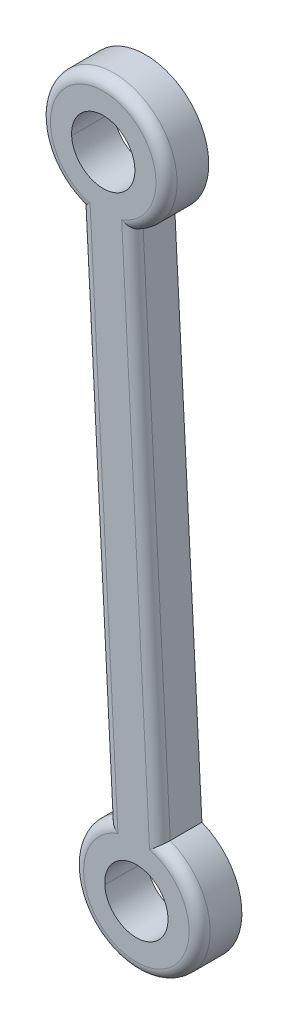
ISO-10303-21;
HEADER;
FILE_DESCRIPTION(('STEP AP214'),'2;1');
FILE_NAME('part.step','',(''),(''),'','','');
FILE_SCHEMA(('AUTOMOTIVE_DESIGN { 1 0 10303 214 1 1 1 1 }'));
ENDSEC;
DATA;
#1=APPLICATION_CONTEXT('core data for automotive mechanical design processes');
#2=APPLICATION_PROTOCOL_DEFINITION('international standard','automotive_design',2000,#1);
#3=PRODUCT_CONTEXT('',#1,'mechanical');
#4=PRODUCT('Part','Part','',(#3));
#5=PRODUCT_RELATED_PRODUCT_CATEGORY('part','',(#4));
#6=PRODUCT_DEFINITION_FORMATION('','',#4);
#7=PRODUCT_DEFINITION_CONTEXT('part definition',#1,'design');
#8=PRODUCT_DEFINITION('design','',#6,#7);
#9=PRODUCT_DEFINITION_SHAPE('','',#8);
#10=(LENGTH_UNIT() NAMED_UNIT(*) SI_UNIT(.MILLI.,.METRE.));
#11=(NAMED_UNIT(*) PLANE_ANGLE_UNIT() SI_UNIT($,.RADIAN.));
#12=(NAMED_UNIT(*) SI_UNIT($,.STERADIAN.) SOLID_ANGLE_UNIT());
#13=UNCERTAINTY_MEASURE_WITH_UNIT(LENGTH_MEASURE(1.E-05),#10,'distance_accuracy_value','');
#14=(GEOMETRIC_REPRESENTATION_CONTEXT(3) GLOBAL_UNCERTAINTY_ASSIGNED_CONTEXT((#13)) GLOBAL_UNIT_ASSIGNED_CONTEXT((#10,
#11,#12)) REPRESENTATION_CONTEXT('',''));
#15=CARTESIAN_POINT('',(0.,0.,0.));
#16=DIRECTION('',(0.,0.,1.));
#17=DIRECTION('',(1.,0.,0.));
#18=AXIS2_PLACEMENT_3D('',#15,#16,#17);
#19=CARTESIAN_POINT('',(302.865836136789,-205.133323148578,53.45));
#20=DIRECTION('',(0.,0.,1.));
#21=DIRECTION('',(-0.998629534754574,-0.052335956242944,0.));
#22=AXIS2_PLACEMENT_3D('',#19,#20,#21);
#23=PLANE('',#22);
#24=CARTESIAN_POINT('',(301.295757449501,-175.174437105941,53.4500000000001));
#25=DIRECTION('',(0.,0.,-1.));
#26=DIRECTION('',(0.998629534754574,0.052335956242944,0.));
#27=AXIS2_PLACEMENT_3D('',#24,#25,#26);
#28=CIRCLE('',#27,1.5);
#29=CARTESIAN_POINT('',(302.793701751633,-175.095933171576,53.4500000000001));
#30=VERTEX_POINT('',#29);
#31=CARTESIAN_POINT('',(299.797813147369,-175.252941040305,53.4500000000001));
#32=VERTEX_POINT('',#31);
#33=EDGE_CURVE('E315',#30,#32,#28,.T.);
#34=ORIENTED_EDGE('',*,*,#33,.F.);
#35=CARTESIAN_POINT('',(301.295757449501,-175.174437105941,53.4500000000001));
#36=DIRECTION('',(0.,0.,-1.));
#37=DIRECTION('',(-0.998629534754574,-0.052335956242944,0.));
#38=AXIS2_PLACEMENT_3D('',#35,#36,#37);
#39=CIRCLE('',#38,1.5);
#40=EDGE_CURVE('E66',#32,#30,#39,.T.);
#41=ORIENTED_EDGE('',*,*,#40,.F.);
#42=EDGE_LOOP('',(#34,#41));
#43=FACE_BOUND('',#42,.T.);
#44=CARTESIAN_POINT('',(302.865836136789,-205.133323148578,53.45));
#45=DIRECTION('',(0.,0.,1.));
#46=DIRECTION('',(0.998629534754574,0.052335956242944,0.));
#47=AXIS2_PLACEMENT_3D('',#44,#45,#46);
#48=CIRCLE('',#47,1.5);
#49=CARTESIAN_POINT('',(304.363780438921,-205.054819214214,53.45));
#50=VERTEX_POINT('',#49);
#51=CARTESIAN_POINT('',(301.367891834657,-205.211827082942,53.45));
#52=VERTEX_POINT('',#51);
#53=EDGE_CURVE('E11',#50,#52,#48,.T.);
#54=ORIENTED_EDGE('',*,*,#53,.T.);
#55=CARTESIAN_POINT('',(302.865836136789,-205.133323148578,53.45));
#56=DIRECTION('',(0.,0.,1.));
#57=DIRECTION('',(-0.998629534754574,-0.052335956242944,0.));
#58=AXIS2_PLACEMENT_3D('',#55,#56,#57);
#59=CIRCLE('',#58,1.5);
#60=EDGE_CURVE('E57',#52,#50,#59,.T.);
#61=ORIENTED_EDGE('',*,*,#60,.T.);
#62=EDGE_LOOP('',(#54,#61));
#63=FACE_BOUND('',#62,.T.);
#64=DIRECTION('',(0.052335956242944,-0.998629534754574,0.));
#65=VECTOR('',#64,1.);
#66=CARTESIAN_POINT('',(300.190200001032,-177.963297577197,53.4500000000001));
#67=LINE('',#66,#65);
#68=CARTESIAN_POINT('',(300.190200001032,-177.963297577197,53.4500000000001));
#69=VERTEX_POINT('',#68);
#70=CARTESIAN_POINT('',(301.474819748371,-202.475302567929,53.45));
#71=VERTEX_POINT('',#70);
#72=EDGE_CURVE('E268',#69,#71,#67,.T.);
#73=ORIENTED_EDGE('',*,*,#72,.F.);
#74=CARTESIAN_POINT('',(301.295757449501,-175.174437105941,53.4500000000001));
#75=DIRECTION('',(0.,0.,1.));
#76=DIRECTION('',(0.46367212947261,-0.886006860216295,0.));
#77=AXIS2_PLACEMENT_3D('',#74,#75,#76);
#78=CIRCLE('',#77,3.);
#79=CARTESIAN_POINT('',(302.686773837919,-177.83245768659,53.4500000000001));
#80=VERTEX_POINT('',#79);
#81=EDGE_CURVE('E159',#80,#69,#78,.T.);
#82=ORIENTED_EDGE('',*,*,#81,.F.);
#83=DIRECTION('',(-0.052335956242944,0.998629534754574,0.));
#84=VECTOR('',#83,1.);
#85=CARTESIAN_POINT('',(303.971393585258,-202.344462677322,53.45));
#86=LINE('',#85,#84);
#87=CARTESIAN_POINT('',(303.971393585258,-202.344462677322,53.45));
#88=VERTEX_POINT('',#87);
#89=EDGE_CURVE('E193',#88,#80,#86,.T.);
#90=ORIENTED_EDGE('',*,*,#89,.F.);
#91=CARTESIAN_POINT('',(302.865836136789,-205.133323148578,53.45));
#92=DIRECTION('',(0.,0.,1.));
#93=DIRECTION('',(-0.46367212947261,0.886006860216295,0.));
#94=AXIS2_PLACEMENT_3D('',#91,#92,#93);
#95=CIRCLE('',#94,3.);
#96=EDGE_CURVE('E252',#71,#88,#95,.T.);
#97=ORIENTED_EDGE('',*,*,#96,.F.);
#98=EDGE_LOOP('',(#73,#82,#90,#97));
#99=FACE_BOUND('',#98,.T.);
#100=ADVANCED_FACE('F46',(#43,#63,#99),#23,.F.);
#101=CARTESIAN_POINT('',(301.295757449501,-175.174437105941,55.4500000000001));
#102=DIRECTION('',(0.,0.,1.));
#103=DIRECTION('',(-0.998629534754574,-0.052335956242944,0.));
#104=AXIS2_PLACEMENT_3D('',#101,#102,#103);
#105=CYLINDRICAL_SURFACE('',#104,1.5);
#106=CARTESIAN_POINT('',(301.295757449501,-175.174437105941,55.4500000000001));
#107=DIRECTION('',(0.,0.,-1.));
#108=DIRECTION('',(0.998629534754574,0.052335956242944,0.));
#109=AXIS2_PLACEMENT_3D('',#106,#107,#108);
#110=CIRCLE('',#109,1.5);
#111=CARTESIAN_POINT('',(302.793701751633,-175.095933171576,55.4500000000001));
#112=VERTEX_POINT('',#111);
#113=CARTESIAN_POINT('',(299.797813147369,-175.252941040305,55.4500000000001));
#114=VERTEX_POINT('',#113);
#115=EDGE_CURVE('E144',#112,#114,#110,.T.);
#116=ORIENTED_EDGE('',*,*,#115,.F.);
#117=DIRECTION('',(0.,0.,-1.));
#118=VECTOR('',#117,1.);
#119=CARTESIAN_POINT('',(302.793701751633,-175.095933171576,55.4500000000001));
#120=LINE('',#119,#118);
#121=EDGE_CURVE('E309',#112,#30,#120,.T.);
#122=ORIENTED_EDGE('',*,*,#121,.T.);
#123=ORIENTED_EDGE('',*,*,#33,.T.);
#124=DIRECTION('',(0.,0.,-1.));
#125=VECTOR('',#124,1.);
#126=CARTESIAN_POINT('',(299.797813147369,-175.252941040305,55.4500000000001));
#127=LINE('',#126,#125);
#128=EDGE_CURVE('E310',#114,#32,#127,.T.);
#129=ORIENTED_EDGE('',*,*,#128,.F.);
#130=EDGE_LOOP('',(#116,#122,#123,#129));
#131=FACE_BOUND('',#130,.T.);
#132=ADVANCED_FACE('F307',(#131),#105,.F.);
#133=CARTESIAN_POINT('',(301.295757449501,-175.174437105941,55.4500000000001));
#134=DIRECTION('',(0.,0.,1.));
#135=DIRECTION('',(-0.998629534754574,-0.052335956242944,0.));
#136=AXIS2_PLACEMENT_3D('',#133,#134,#135);
#137=CYLINDRICAL_SURFACE('',#136,1.5);
#138=ORIENTED_EDGE('',*,*,#40,.T.);
#139=ORIENTED_EDGE('',*,*,#121,.F.);
#140=CARTESIAN_POINT('',(301.295757449501,-175.174437105941,55.4500000000001));
#141=DIRECTION('',(0.,0.,-1.));
#142=DIRECTION('',(-0.998629534754574,-0.052335956242944,0.));
#143=AXIS2_PLACEMENT_3D('',#140,#141,#142);
#144=CIRCLE('',#143,1.5);
#145=EDGE_CURVE('E155',#114,#112,#144,.T.);
#146=ORIENTED_EDGE('',*,*,#145,.F.);
#147=ORIENTED_EDGE('',*,*,#128,.T.);
#148=EDGE_LOOP('',(#138,#139,#146,#147));
#149=FACE_BOUND('',#148,.T.);
#150=ADVANCED_FACE('F314',(#149),#137,.F.);
#151=CARTESIAN_POINT('',(302.865836136789,-205.133323148578,55.45));
#152=DIRECTION('',(0.,0.,-1.));
#153=DIRECTION('',(-0.998629534754574,-0.052335956242944,0.));
#154=AXIS2_PLACEMENT_3D('',#151,#152,#153);
#155=CYLINDRICAL_SURFACE('',#154,1.5);
#156=DIRECTION('',(0.,0.,-1.));
#157=VECTOR('',#156,1.);
#158=CARTESIAN_POINT('',(304.363780438921,-205.054819214214,55.45));
#159=LINE('',#158,#157);
#160=CARTESIAN_POINT('',(304.363780438921,-205.054819214214,55.45));
#161=VERTEX_POINT('',#160);
#162=EDGE_CURVE('E327',#161,#50,#159,.T.);
#163=ORIENTED_EDGE('',*,*,#162,.F.);
#164=CARTESIAN_POINT('',(302.865836136789,-205.133323148578,55.45));
#165=DIRECTION('',(0.,0.,1.));
#166=DIRECTION('',(0.998629534754574,0.052335956242944,0.));
#167=AXIS2_PLACEMENT_3D('',#164,#165,#166);
#168=CIRCLE('',#167,1.5);
#169=CARTESIAN_POINT('',(301.367891834657,-205.211827082942,55.45));
#170=VERTEX_POINT('',#169);
#171=EDGE_CURVE('E325',#161,#170,#168,.T.);
#172=ORIENTED_EDGE('',*,*,#171,.T.);
#173=DIRECTION('',(0.,0.,-1.));
#174=VECTOR('',#173,1.);
#175=CARTESIAN_POINT('',(301.367891834657,-205.211827082942,55.45));
#176=LINE('',#175,#174);
#177=EDGE_CURVE('E322',#170,#52,#176,.T.);
#178=ORIENTED_EDGE('',*,*,#177,.T.);
#179=ORIENTED_EDGE('',*,*,#53,.F.);
#180=EDGE_LOOP('',(#163,#172,#178,#179));
#181=FACE_BOUND('',#180,.T.);
#182=ADVANCED_FACE('F230',(#181),#155,.F.);
#183=CARTESIAN_POINT('',(302.865836136789,-205.133323148578,55.45));
#184=DIRECTION('',(0.,0.,-1.));
#185=DIRECTION('',(-0.998629534754574,-0.052335956242944,0.));
#186=AXIS2_PLACEMENT_3D('',#183,#184,#185);
#187=CYLINDRICAL_SURFACE('',#186,1.5);
#188=ORIENTED_EDGE('',*,*,#177,.F.);
#189=CARTESIAN_POINT('',(302.865836136789,-205.133323148578,55.45));
#190=DIRECTION('',(0.,0.,1.));
#191=DIRECTION('',(-0.998629534754574,-0.052335956242944,0.));
#192=AXIS2_PLACEMENT_3D('',#189,#190,#191);
#193=CIRCLE('',#192,1.5);
#194=EDGE_CURVE('E326',#170,#161,#193,.T.);
#195=ORIENTED_EDGE('',*,*,#194,.T.);
#196=ORIENTED_EDGE('',*,*,#162,.T.);
#197=ORIENTED_EDGE('',*,*,#60,.F.);
#198=EDGE_LOOP('',(#188,#195,#196,#197));
#199=FACE_BOUND('',#198,.T.);
#200=ADVANCED_FACE('F335',(#199),#187,.F.);
#201=CARTESIAN_POINT('',(300.190200001032,-177.963297577197,53.4500000000001));
#202=DIRECTION('',(-0.998629534754574,-0.052335956242944,0.));
#203=DIRECTION('',(0.052335956242944,-0.998629534754574,0.));
#204=AXIS2_PLACEMENT_3D('',#201,#202,#203);
#205=PLANE('',#204);
#206=DIRECTION('',(0.,0.,1.));
#207=VECTOR('',#206,1.);
#208=CARTESIAN_POINT('',(300.190200001032,-177.963297577197,53.4500000000001));
#209=LINE('',#208,#207);
#210=CARTESIAN_POINT('',(300.190200001008,-177.963297576747,54.9500000000001));
#211=VERTEX_POINT('',#210);
#212=EDGE_CURVE('E192',#69,#211,#209,.T.);
#213=ORIENTED_EDGE('',*,*,#212,.F.);
#214=ORIENTED_EDGE('',*,*,#72,.T.);
#215=DIRECTION('',(0.,0.,1.));
#216=VECTOR('',#215,1.);
#217=CARTESIAN_POINT('',(301.474819748371,-202.475302567929,53.45));
#218=LINE('',#217,#216);
#219=CARTESIAN_POINT('',(301.474819748528,-202.475302568228,54.95));
#220=VERTEX_POINT('',#219);
#221=EDGE_CURVE('E264',#71,#220,#218,.T.);
#222=ORIENTED_EDGE('',*,*,#221,.T.);
#223=DIRECTION('',(-0.052335956242944,0.998629534754574,0.));
#224=VECTOR('',#223,1.);
#225=CARTESIAN_POINT('',(301.474819748371,-202.475302567929,54.95));
#226=LINE('',#225,#224);
#227=EDGE_CURVE('E153',#220,#211,#226,.T.);
#228=ORIENTED_EDGE('',*,*,#227,.T.);
#229=EDGE_LOOP('',(#213,#214,#222,#228));
#230=FACE_BOUND('',#229,.T.);
#231=ADVANCED_FACE('F298',(#230),#205,.T.);
#232=CARTESIAN_POINT('',(301.295757449501,-175.174437105941,53.4500000000001));
#233=DIRECTION('',(0.,0.,-1.));
#234=DIRECTION('',(-0.998629534754574,-0.052335956242944,0.));
#235=AXIS2_PLACEMENT_3D('',#232,#233,#234);
#236=CYLINDRICAL_SURFACE('',#235,3.);
#237=ORIENTED_EDGE('',*,*,#81,.T.);
#238=ORIENTED_EDGE('',*,*,#212,.T.);
#239=CARTESIAN_POINT('',(301.295757449501,-175.174437105941,54.9500000000001));
#240=DIRECTION('',(0.,0.,-1.));
#241=DIRECTION('',(-0.368519149605924,-0.929620157039276,0.));
#242=AXIS2_PLACEMENT_3D('',#239,#240,#241);
#243=CIRCLE('',#242,2.99999999918055);
#244=CARTESIAN_POINT('',(302.68677383784,-177.832457686399,54.9500000000001));
#245=VERTEX_POINT('',#244);
#246=EDGE_CURVE('E112',#211,#245,#243,.T.);
#247=ORIENTED_EDGE('',*,*,#246,.T.);
#248=DIRECTION('',(0.,0.,1.));
#249=VECTOR('',#248,1.);
#250=CARTESIAN_POINT('',(302.686773837919,-177.83245768659,53.4500000000001));
#251=LINE('',#250,#249);
#252=EDGE_CURVE('E284',#80,#245,#251,.T.);
#253=ORIENTED_EDGE('',*,*,#252,.F.);
#254=EDGE_LOOP('',(#237,#238,#247,#253));
#255=FACE_BOUND('',#254,.T.);
#256=ADVANCED_FACE('F293',(#255),#236,.T.);
#257=CARTESIAN_POINT('',(303.971393585258,-202.344462677322,53.45));
#258=DIRECTION('',(0.998629534754574,0.052335956242944,0.));
#259=DIRECTION('',(-0.052335956242944,0.998629534754574,0.));
#260=AXIS2_PLACEMENT_3D('',#257,#258,#259);
#261=PLANE('',#260);
#262=DIRECTION('',(0.,0.,1.));
#263=VECTOR('',#262,1.);
#264=CARTESIAN_POINT('',(303.971393585258,-202.344462677322,53.45));
#265=LINE('',#264,#263);
#266=CARTESIAN_POINT('',(303.971393585133,-202.344462677635,54.95));
#267=VERTEX_POINT('',#266);
#268=EDGE_CURVE('E246',#88,#267,#265,.T.);
#269=ORIENTED_EDGE('',*,*,#268,.F.);
#270=ORIENTED_EDGE('',*,*,#89,.T.);
#271=ORIENTED_EDGE('',*,*,#252,.T.);
#272=DIRECTION('',(0.052335956242944,-0.998629534754574,0.));
#273=VECTOR('',#272,1.);
#274=CARTESIAN_POINT('',(302.686773837919,-177.83245768659,54.9500000000001));
#275=LINE('',#274,#273);
#276=EDGE_CURVE('E255',#245,#267,#275,.T.);
#277=ORIENTED_EDGE('',*,*,#276,.T.);
#278=EDGE_LOOP('',(#269,#270,#271,#277));
#279=FACE_BOUND('',#278,.T.);
#280=ADVANCED_FACE('F287',(#279),#261,.T.);
#281=CARTESIAN_POINT('',(302.865836136789,-205.133323148578,53.45));
#282=DIRECTION('',(0.,0.,-1.));
#283=DIRECTION('',(-0.998629534754574,-0.052335956242944,0.));
#284=AXIS2_PLACEMENT_3D('',#281,#282,#283);
#285=CYLINDRICAL_SURFACE('',#284,3.);
#286=ORIENTED_EDGE('',*,*,#221,.F.);
#287=ORIENTED_EDGE('',*,*,#96,.T.);
#288=ORIENTED_EDGE('',*,*,#268,.T.);
#289=CARTESIAN_POINT('',(302.865836136789,-205.133323148578,54.95));
#290=DIRECTION('',(0.,0.,-1.));
#291=DIRECTION('',(0.368519149489536,0.929620157085414,0.));
#292=AXIS2_PLACEMENT_3D('',#289,#290,#291);
#293=CIRCLE('',#292,2.99999999932575);
#294=EDGE_CURVE('E103',#267,#220,#293,.T.);
#295=ORIENTED_EDGE('',*,*,#294,.T.);
#296=EDGE_LOOP('',(#286,#287,#288,#295));
#297=FACE_BOUND('',#296,.T.);
#298=ADVANCED_FACE('F175',(#297),#285,.T.);
#299=CARTESIAN_POINT('',(302.865836136789,-205.133323148578,55.45));
#300=DIRECTION('',(0.,0.,1.));
#301=DIRECTION('',(-0.998629534754574,-0.052335956242944,0.));
#302=AXIS2_PLACEMENT_3D('',#299,#300,#301);
#303=PLANE('',#302);
#304=DIRECTION('',(-0.052335956242944,0.998629534754574,0.));
#305=VECTOR('',#304,1.);
#306=CARTESIAN_POINT('',(303.489994987132,-202.712491529864,55.45));
#307=LINE('',#306,#305);
#308=CARTESIAN_POINT('',(303.489994987132,-202.712491529864,55.45));
#309=VERTEX_POINT('',#308);
#310=CARTESIAN_POINT('',(302.169542901281,-177.516764790139,55.4500000000001));
#311=VERTEX_POINT('',#310);
#312=EDGE_CURVE('E200',#309,#311,#307,.T.);
#313=ORIENTED_EDGE('',*,*,#312,.T.);
#314=CARTESIAN_POINT('',(301.295757449501,-175.174437105941,55.4500000000001));
#315=DIRECTION('',(0.,0.,1.));
#316=DIRECTION('',(0.349514180826739,-0.936931073986242,0.));
#317=AXIS2_PLACEMENT_3D('',#314,#315,#316);
#318=CIRCLE('',#317,2.49999999918055);
#319=CARTESIAN_POINT('',(300.671598599149,-177.595268724503,55.4500000000001));
#320=VERTEX_POINT('',#319);
#321=EDGE_CURVE('E148',#311,#320,#318,.T.);
#322=ORIENTED_EDGE('',*,*,#321,.T.);
#323=DIRECTION('',(0.052335956242944,-0.998629534754574,0.));
#324=VECTOR('',#323,1.);
#325=CARTESIAN_POINT('',(300.671598599149,-177.595268724503,55.4500000000001));
#326=LINE('',#325,#324);
#327=CARTESIAN_POINT('',(301.99205068501,-202.790995464206,55.45));
#328=VERTEX_POINT('',#327);
#329=EDGE_CURVE('E128',#320,#328,#326,.T.);
#330=ORIENTED_EDGE('',*,*,#329,.T.);
#331=CARTESIAN_POINT('',(302.865836136789,-205.133323148578,55.45));
#332=DIRECTION('',(0.,0.,1.));
#333=DIRECTION('',(-0.349514180803439,0.936931073994935,0.));
#334=AXIS2_PLACEMENT_3D('',#331,#332,#333);
#335=CIRCLE('',#334,2.49999999932575);
#336=EDGE_CURVE('E135',#328,#309,#335,.T.);
#337=ORIENTED_EDGE('',*,*,#336,.T.);
#338=EDGE_LOOP('',(#313,#322,#330,#337));
#339=FACE_BOUND('',#338,.T.);
#340=ORIENTED_EDGE('',*,*,#115,.T.);
#341=ORIENTED_EDGE('',*,*,#145,.T.);
#342=EDGE_LOOP('',(#340,#341));
#343=FACE_BOUND('',#342,.T.);
#344=ORIENTED_EDGE('',*,*,#171,.F.);
#345=ORIENTED_EDGE('',*,*,#194,.F.);
#346=EDGE_LOOP('',(#344,#345));
#347=FACE_BOUND('',#346,.T.);
#348=ADVANCED_FACE('F146',(#339,#343,#347),#303,.T.);
#349=CARTESIAN_POINT('',(304.729977346551,-255.033748334242,54.9499999999998));
#350=DIRECTION('',(0.052335956242944,-0.998629534754574,0.));
#351=DIRECTION('',(-0.998629534754574,-0.052335956242944,0.));
#352=AXIS2_PLACEMENT_3D('',#349,#350,#351);
#353=CYLINDRICAL_SURFACE('',#352,0.5);
#354=CARTESIAN_POINT('',(300.190200000985,-177.963297576297,54.9500000000001));
#355=CARTESIAN_POINT('',(300.190222896927,-177.96330668927,54.9544047902578));
#356=CARTESIAN_POINT('',(300.190300763952,-177.963274908456,54.9588093734923));
#357=CARTESIAN_POINT('',(300.190566216192,-177.963129740869,54.967614633719));
#358=CARTESIAN_POINT('',(300.190753819973,-177.963016340286,54.972015309924));
#359=CARTESIAN_POINT('',(300.191238619374,-177.962708044702,54.9808096846352));
#360=CARTESIAN_POINT('',(300.191535862685,-177.962513114235,54.9852033792681));
#361=CARTESIAN_POINT('',(300.192239694194,-177.962041947289,54.993980734078));
#362=CARTESIAN_POINT('',(300.192646358822,-177.961765653968,54.9983643850731));
#363=CARTESIAN_POINT('',(300.193568729661,-177.961131982391,55.007118606718));
#364=CARTESIAN_POINT('',(300.194084540493,-177.960774526315,55.0114891607081));
#365=CARTESIAN_POINT('',(300.195224827588,-177.95997879452,55.0202141569573));
#366=CARTESIAN_POINT('',(300.195849435928,-177.959540420531,55.024568572987));
#367=CARTESIAN_POINT('',(300.197206874302,-177.958583159027,55.0332582780565));
#368=CARTESIAN_POINT('',(300.197939862971,-177.958064153435,55.0375935293002));
#369=CARTESIAN_POINT('',(300.199513550153,-177.956945976323,55.0462419076758));
#370=CARTESIAN_POINT('',(300.200354432802,-177.956346667676,55.0505549835612));
#371=CARTESIAN_POINT('',(300.202143329293,-177.955068272977,55.059156034518));
#372=CARTESIAN_POINT('',(300.20309155157,-177.954389031606,55.0634439431384));
#373=CARTESIAN_POINT('',(300.205094482053,-177.95295120122,55.0719917038913));
#374=CARTESIAN_POINT('',(300.206149421662,-177.952192439642,55.0762514727543));
#375=CARTESIAN_POINT('',(300.208365078199,-177.950596037966,55.084740026207));
#376=CARTESIAN_POINT('',(300.209526048056,-177.949758209091,55.0889687092606));
#377=CARTESIAN_POINT('',(300.211952985582,-177.948004187382,55.0973921744651));
#378=CARTESIAN_POINT('',(300.213219226144,-177.947087790671,55.101586835482));
#379=CARTESIAN_POINT('',(300.215855887863,-177.94517716972,55.1099394226573));
#380=CARTESIAN_POINT('',(300.217226600323,-177.944182727614,55.1140972071159));
#381=CARTESIAN_POINT('',(300.220071231755,-177.942116661724,55.122373030551));
#382=CARTESIAN_POINT('',(300.221545458458,-177.94104480751,55.1264909056922));
#383=CARTESIAN_POINT('',(300.226129480189,-177.93770861707,55.1388018793964));
#384=CARTESIAN_POINT('',(300.229387437031,-177.935333202599,55.1469106140925));
#385=CARTESIAN_POINT('',(300.236302733767,-177.930282616005,55.162936301088));
#386=CARTESIAN_POINT('',(300.239962851343,-177.927605355263,55.170851389584));
#387=CARTESIAN_POINT('',(300.247673343973,-177.921957122144,55.1864691914468));
#388=CARTESIAN_POINT('',(300.251726637635,-177.918983948126,55.1941696676701));
#389=CARTESIAN_POINT('',(300.260213097229,-177.912750847888,55.2093372061702));
#390=CARTESIAN_POINT('',(300.264649263587,-177.909488650191,55.2168016521269));
#391=CARTESIAN_POINT('',(300.273890832729,-177.902684713944,55.231477589131));
#392=CARTESIAN_POINT('',(300.278699269752,-177.899140670006,55.238686103887));
#393=CARTESIAN_POINT('',(300.286268735831,-177.89355547706,55.2494206135008));
#394=CARTESIAN_POINT('',(300.288918263341,-177.891599424706,55.2530704933058));
#395=CARTESIAN_POINT('',(300.294313178395,-177.887614538071,55.2602930509176));
#396=CARTESIAN_POINT('',(300.297058989871,-177.885585380439,55.2638652334513));
#397=CARTESIAN_POINT('',(300.305459205096,-177.879373651753,55.2744903395465));
#398=CARTESIAN_POINT('',(300.311235208497,-177.875097195709,55.2813934918694));
#399=CARTESIAN_POINT('',(300.321585251172,-177.867431868185,55.2930916061978));
#400=CARTESIAN_POINT('',(300.326093375,-177.864092389165,55.297977838055));
#401=CARTESIAN_POINT('',(300.333004730021,-177.858971624663,55.3051664623197));
#402=CARTESIAN_POINT('',(300.335350294861,-177.85723357216,55.3075553960066));
#403=CARTESIAN_POINT('',(300.340101480028,-177.85371147064,55.3122955373262));
#404=CARTESIAN_POINT('',(300.342507457625,-177.851927142829,55.3146461792449));
#405=CARTESIAN_POINT('',(300.350071445398,-177.846314347681,55.3218846655431));
#406=CARTESIAN_POINT('',(300.355293983544,-177.842434475516,55.326665851909));
#407=CARTESIAN_POINT('',(300.365990122469,-177.834473582757,55.3360420554451));
#408=CARTESIAN_POINT('',(300.371466626504,-177.830390121994,55.340631675272));
#409=CARTESIAN_POINT('',(300.382663737739,-177.8220215353,55.3496086194372));
#410=CARTESIAN_POINT('',(300.388387007979,-177.817734049138,55.3539904211331));
#411=CARTESIAN_POINT('',(300.400069778895,-177.808957890901,55.3625351703377));
#412=CARTESIAN_POINT('',(300.40603169622,-177.804466954997,55.366692484146));
#413=CARTESIAN_POINT('',(300.41818340554,-177.795285172582,55.3747716835833));
#414=CARTESIAN_POINT('',(300.424375371621,-177.790592169529,55.3786878450201));
#415=CARTESIAN_POINT('',(300.43697824403,-177.781008448455,55.3862681110059));
#416=CARTESIAN_POINT('',(300.443391085174,-177.776115692769,55.3899264188271));
#417=CARTESIAN_POINT('',(300.456426251038,-177.766135615801,55.3969743855329));
#418=CARTESIAN_POINT('',(300.463050276629,-177.761046386305,55.4003581929182));
#419=CARTESIAN_POINT('',(300.47649785429,-177.750677521182,55.4068406635461));
#420=CARTESIAN_POINT('',(300.483322879696,-177.745396116795,55.4099334374435));
#421=CARTESIAN_POINT('',(300.497162038297,-177.734648118761,55.4158175162518));
#422=CARTESIAN_POINT('',(300.504177424826,-177.72917990509,55.4186029102431));
#423=CARTESIAN_POINT('',(300.518386467385,-177.718064609169,55.4238561492795));
#424=CARTESIAN_POINT('',(300.52558116519,-177.712416064209,55.4263180774079));
#425=CARTESIAN_POINT('',(300.540137620947,-177.70094757266,55.4309086281944));
#426=CARTESIAN_POINT('',(300.547500218346,-177.695126328521,55.4330313428337));
#427=CARTESIAN_POINT('',(300.562380949325,-177.683321090643,55.436928115923));
#428=CARTESIAN_POINT('',(300.569899729948,-177.677335971618,55.4386962894702));
#429=CARTESIAN_POINT('',(300.585081044402,-177.665212854449,55.4418691183609));
#430=CARTESIAN_POINT('',(300.59274404326,-177.65907390962,55.4432679254103));
#431=CARTESIAN_POINT('',(300.608201841619,-177.646654260773,55.4456877439538));
#432=CARTESIAN_POINT('',(300.615996935295,-177.640372794294,55.4467029566699));
#433=CARTESIAN_POINT('',(300.631706791677,-177.627680485312,55.4483419537055));
#434=CARTESIAN_POINT('',(300.639621688017,-177.621269069318,55.4489600005052));
#435=CARTESIAN_POINT('',(300.655559236364,-177.60833055747,55.4497918874224));
#436=CARTESIAN_POINT('',(300.663581876485,-177.601803081587,55.4500000639242));
#437=CARTESIAN_POINT('',(300.671598599149,-177.595268724503,55.4500000000001));
#438=B_SPLINE_CURVE_WITH_KNOTS('',3,(#354,#355,#356,#357,#358,#359,#360,#361,#362,#363,#364,
#365,#366,#367,#368,#369,#370,#371,#372,#373,#374,#375,#376,#377,#378,#379,#380,#381,#382,#383,
#384,#385,#386,#387,#388,#389,#390,#391,#392,#393,#394,#395,#396,#397,#398,#399,#400,#401,#402,
#403,#404,#405,#406,#407,#408,#409,#410,#411,#412,#413,#414,#415,#416,#417,#418,#419,#420,#421,
#422,#423,#424,#425,#426,#427,#428,#429,#430,#431,#432,#433,#434,#435,#436,#437),.UNSPECIFIED.,
.F.,.F.,(4,2,2,2,2,2,2,2,2,2,2,2,2,2,2,2,2,2,2,2,2,2,2,2,2,2,2,2,2,2,2,2,2,2,2,2,2,2,2,2,2,4),
(0.,0.0132140372310107,0.0264303107231762,0.0396523396862415,0.0528836280851799,
0.0661276570346532,0.0793878773243685,0.0926677021161071,0.1059704998511,0.119299587403812,
0.132658223515882,0.146049602540492,0.159476848524342,0.172943009650882,0.186451053064825,
0.213601249523303,0.240952407870627,0.26852491751543,0.296337515828625,0.324407222898679,
0.339153661903611,0.353976157929997,0.383853589656666,0.406166891569874,0.417482754915368,
0.428904987790188,0.453118779717064,0.477801420642353,0.502954483710939,0.528578490848774,
0.554672977441421,0.581236558333345,0.608266995090841,0.635761264504117,0.663715628324194,
0.692125704237279,0.720986538077343,0.750292677266189,0.780038245454732,0.810217018316912,
0.84082250042334,0.871848003094878),.UNSPECIFIED.);
#439=EDGE_CURVE('E156',#211,#320,#438,.T.);
#440=ORIENTED_EDGE('',*,*,#439,.F.);
#441=ORIENTED_EDGE('',*,*,#227,.F.);
#442=CARTESIAN_POINT('',(301.474819748403,-202.475302568541,54.95));
#443=CARTESIAN_POINT('',(301.47482076719,-202.475322767503,54.9545077970523));
#444=CARTESIAN_POINT('',(301.474884684455,-202.475376854422,54.9590154240043));
#445=CARTESIAN_POINT('',(301.4751379719,-202.475552806157,54.9680246701921));
#446=CARTESIAN_POINT('',(301.475327309882,-202.475674653577,54.9725262906728));
#447=CARTESIAN_POINT('',(301.47583109934,-202.475986140976,54.981520241956));
#448=CARTESIAN_POINT('',(301.476145552691,-202.476175781971,54.9860125726185));
#449=CARTESIAN_POINT('',(301.476899085443,-202.476622857276,54.9949846845521));
#450=CARTESIAN_POINT('',(301.47733820054,-202.476880311002,54.9994644618572));
#451=CARTESIAN_POINT('',(301.478340498715,-202.477463022073,55.0084082279594));
#452=CARTESIAN_POINT('',(301.478903750872,-202.477788317164,55.0128722065543));
#453=CARTESIAN_POINT('',(301.48015367491,-202.478506724559,55.0217811600537));
#454=CARTESIAN_POINT('',(301.480840448633,-202.478899892813,55.026226116155));
#455=CARTESIAN_POINT('',(301.482336683843,-202.47975406511,55.0350938353673));
#456=CARTESIAN_POINT('',(301.483146279145,-202.480215143125,55.0395165687695));
#457=CARTESIAN_POINT('',(301.484887341415,-202.481205158069,55.048336681422));
#458=CARTESIAN_POINT('',(301.485818973216,-202.481734186758,55.0527340178275));
#459=CARTESIAN_POINT('',(301.487803209756,-202.482860130812,55.0615002056152));
#460=CARTESIAN_POINT('',(301.488856009231,-202.48345715544,55.0658689988743));
#461=CARTESIAN_POINT('',(301.491081600742,-202.484719123874,55.074575001773));
#462=CARTESIAN_POINT('',(301.492254616154,-202.485384194111,55.0789121359685));
#463=CARTESIAN_POINT('',(301.494719578935,-202.486782290499,55.0875517569051));
#464=CARTESIAN_POINT('',(301.496011776916,-202.487515459869,55.0918541489511));
#465=CARTESIAN_POINT('',(301.498713964487,-202.489049797377,55.1004212568793));
#466=CARTESIAN_POINT('',(301.500124230392,-202.4898511251,55.1046858570037));
#467=CARTESIAN_POINT('',(301.503061337777,-202.491521821158,55.1131743956));
#468=CARTESIAN_POINT('',(301.50458847963,-202.492391364963,55.1173981955862));
#469=CARTESIAN_POINT('',(301.507758038111,-202.494198560655,55.1258021705478));
#470=CARTESIAN_POINT('',(301.509400777392,-202.495136403453,55.1299821827198));
#471=CARTESIAN_POINT('',(301.512800185489,-202.497080190264,55.1382957288865));
#472=CARTESIAN_POINT('',(301.514557197488,-202.498086339853,55.1424290745741));
#473=CARTESIAN_POINT('',(301.518183616613,-202.500167033678,55.1506462234414));
#474=CARTESIAN_POINT('',(301.520053385145,-202.501241798563,55.1547298107259));
#475=CARTESIAN_POINT('',(301.52552775908,-202.504393724678,55.1662671926867));
#476=CARTESIAN_POINT('',(301.529258326858,-202.506547695418,55.1736408614329));
#477=CARTESIAN_POINT('',(301.537121978399,-202.511096706642,55.188267349439));
#478=CARTESIAN_POINT('',(301.541260839333,-202.513495230444,55.1955159663503));
#479=CARTESIAN_POINT('',(301.549940769632,-202.518534004575,55.2098701932716));
#480=CARTESIAN_POINT('',(301.554487603683,-202.521177746625,55.2169710906832));
#481=CARTESIAN_POINT('',(301.5639816256,-202.526706883619,55.2310067559887));
#482=CARTESIAN_POINT('',(301.5689345092,-202.529595748562,55.2379362992371));
#483=CARTESIAN_POINT('',(301.579237474215,-202.535615384346,55.2516058766639));
#484=CARTESIAN_POINT('',(301.58459313344,-202.538749594287,55.2583401879746));
#485=CARTESIAN_POINT('',(301.595697082076,-202.545260149089,55.2715955963331));
#486=CARTESIAN_POINT('',(301.601450783886,-202.548639888902,55.2781104874021));
#487=CARTESIAN_POINT('',(301.613344658659,-202.555642039819,55.2909030189969));
#488=CARTESIAN_POINT('',(301.619490031408,-202.559267796694,55.2971739872726));
#489=CARTESIAN_POINT('',(301.632159998965,-202.566761837269,55.3094549003493));
#490=CARTESIAN_POINT('',(301.638689546834,-202.570633395911,55.315457735865));
#491=CARTESIAN_POINT('',(301.651029233317,-202.577974599733,55.3262273325852));
#492=CARTESIAN_POINT('',(301.656806745916,-202.581421333669,55.3310472622893));
#493=CARTESIAN_POINT('',(301.668685943481,-202.588527717915,55.3405252004158));
#494=CARTESIAN_POINT('',(301.674792174445,-202.592190618787,55.3451750747142));
#495=CARTESIAN_POINT('',(301.687328568722,-202.599728885655,55.3542893563525));
#496=CARTESIAN_POINT('',(301.693763025962,-202.603607319697,55.3587453127354));
#497=CARTESIAN_POINT('',(301.706953971917,-202.611577095263,55.3674473687524));
#498=CARTESIAN_POINT('',(301.713714472738,-202.61567135626,55.3716847080882));
#499=CARTESIAN_POINT('',(301.727553933674,-202.624073130722,55.3799245142344));
#500=CARTESIAN_POINT('',(301.734636597122,-202.628383420949,55.3839179235264));
#501=CARTESIAN_POINT('',(301.749115171223,-202.637217521986,55.3916443490696));
#502=CARTESIAN_POINT('',(301.756514453076,-202.641743973175,55.3953680244193));
#503=CARTESIAN_POINT('',(301.771618606305,-202.651011612101,55.4025288000286));
#504=CARTESIAN_POINT('',(301.779326475478,-202.65575533587,55.405956284376));
#505=CARTESIAN_POINT('',(301.795040342896,-202.665455441509,55.4124990143437));
#506=CARTESIAN_POINT('',(301.803048993612,-202.670414179589,55.4156044056454));
#507=CARTESIAN_POINT('',(301.817081478752,-202.679146096593,55.4206581126417));
#508=CARTESIAN_POINT('',(301.823086492434,-202.682896473206,55.422698698014));
#509=CARTESIAN_POINT('',(301.835534022732,-202.690699532605,55.4266819470254));
#510=CARTESIAN_POINT('',(301.841979218951,-202.694755810465,55.4286092200481));
#511=CARTESIAN_POINT('',(301.855311500215,-202.703168817001,55.4323229381468));
#512=CARTESIAN_POINT('',(301.86220117929,-202.70752856557,55.4340932139929));
#513=CARTESIAN_POINT('',(301.876422744884,-202.716549515317,55.4374466367781));
#514=CARTESIAN_POINT('',(301.883756920748,-202.721213430414,55.439012776632));
#515=CARTESIAN_POINT('',(301.898864925202,-202.73084299161,55.4419090207028));
#516=CARTESIAN_POINT('',(301.906640632601,-202.735811057638,55.4432212767852));
#517=CARTESIAN_POINT('',(301.92262520541,-202.746049611175,55.445558224173));
#518=CARTESIAN_POINT('',(301.93083539881,-202.751322293437,55.4465642225102));
#519=CARTESIAN_POINT('',(301.947678114133,-202.762170800836,55.4482347791471));
#520=CARTESIAN_POINT('',(301.95631128068,-202.767748631576,55.4488798101134));
#521=CARTESIAN_POINT('',(301.973984041249,-202.77920875492,55.44977261867));
#522=CARTESIAN_POINT('',(301.983023453758,-202.785092919993,55.4500000622482));
#523=CARTESIAN_POINT('',(301.992050685016,-202.790995464222,55.45));
#524=B_SPLINE_CURVE_WITH_KNOTS('',3,(#442,#443,#444,#445,#446,#447,#448,#449,#450,#451,#452,
#453,#454,#455,#456,#457,#458,#459,#460,#461,#462,#463,#464,#465,#466,#467,#468,#469,#470,#471,
#472,#473,#474,#475,#476,#477,#478,#479,#480,#481,#482,#483,#484,#485,#486,#487,#488,#489,#490,
#491,#492,#493,#494,#495,#496,#497,#498,#499,#500,#501,#502,#503,#504,#505,#506,#507,#508,#509,
#510,#511,#512,#513,#514,#515,#516,#517,#518,#519,#520,#521,#522,#523),.UNSPECIFIED.,.F.,.F.,(4,
2,2,2,2,2,2,2,2,2,2,2,2,2,2,2,2,2,2,2,2,2,2,2,2,2,2,2,2,2,2,2,2,2,2,2,2,2,2,2,4),(0.,
0.0135229562709107,0.02704244228148,0.0405621307491105,0.0540856942262624,0.0676168021101648,
0.081159117665417,0.094716295071396,0.108291976506342,0.121889789279578,0.135513343022878,
0.149166226951324,0.16285200720375,0.176574224271702,0.19033639052519,0.204141987843126,
0.217994465354696,0.243599832289469,0.269641655234214,0.296138559156295,0.323108226179812,
0.350567425111577,0.378532044101507,0.407017125550043,0.436036902488037,0.460857312558455,
0.486362386994162,0.51255922527724,0.539454378850707,0.567053901643228,0.595363395474642,
0.62438805086282,0.654132683710176,0.676233571707941,0.699795463269857,0.724820018951917,
0.751308620169889,0.779262427232033,0.80868242302936,0.839569446426736,0.871924218128672),.UNSPECIFIED.);
#525=EDGE_CURVE('E136',#220,#328,#524,.T.);
#526=ORIENTED_EDGE('',*,*,#525,.T.);
#527=ORIENTED_EDGE('',*,*,#329,.F.);
#528=EDGE_LOOP('',(#440,#441,#526,#527));
#529=FACE_BOUND('',#528,.T.);
#530=ADVANCED_FACE('F151',(#529),#353,.T.);
#531=CARTESIAN_POINT('',(301.295757449501,-175.174437105941,54.9500000000001));
#532=DIRECTION('',(0.,0.,1.));
#533=DIRECTION('',(-0.341168635666187,-0.940002107464485,0.));
#534=AXIS2_PLACEMENT_3D('',#531,#532,#533);
#535=TOROIDAL_SURFACE('',#534,2.49999999918055,0.5);
#536=ORIENTED_EDGE('',*,*,#439,.T.);
#537=ORIENTED_EDGE('',*,*,#321,.F.);
#538=CARTESIAN_POINT('',(302.169542901281,-177.516764790139,55.4500000000001));
#539=CARTESIAN_POINT('',(302.178109534802,-177.522367048418,55.4500000567948));
#540=CARTESIAN_POINT('',(302.186681762718,-177.527961158828,55.4497961543283));
#541=CARTESIAN_POINT('',(302.203703560415,-177.539041129757,55.4489818154499));
#542=CARTESIAN_POINT('',(302.212153143102,-177.544527399286,55.4483771940819));
#543=CARTESIAN_POINT('',(302.228916292693,-177.555379606024,55.4467747784772));
#544=CARTESIAN_POINT('',(302.237230040921,-177.560746129406,55.4457828660081));
#545=CARTESIAN_POINT('',(302.25370811094,-177.571348152092,55.4434200308347));
#546=CARTESIAN_POINT('',(302.261872796731,-177.576584407237,55.4420550441217));
#547=CARTESIAN_POINT('',(302.278039664969,-177.586916480379,55.4389608231971));
#548=CARTESIAN_POINT('',(302.286042403561,-177.592013216878,55.4372375676465));
#549=CARTESIAN_POINT('',(302.301872620648,-177.60205810448,55.4334421083459));
#550=CARTESIAN_POINT('',(302.309700857697,-177.607007328735,55.4313759133974));
#551=CARTESIAN_POINT('',(302.325169717719,-177.616750262215,55.4269103155403));
#552=CARTESIAN_POINT('',(302.332811311106,-177.621545190645,55.4245169386094));
#553=CARTESIAN_POINT('',(302.347894981266,-177.630973778056,55.4194130751308));
#554=CARTESIAN_POINT('',(302.355338249281,-177.635608793032,55.4167086182056));
#555=CARTESIAN_POINT('',(302.370013866748,-177.644712925262,55.4109989696861));
#556=CARTESIAN_POINT('',(302.377247636556,-177.649183525432,55.4079997972994));
#557=CARTESIAN_POINT('',(302.391493396366,-177.657955274781,55.4017172923262));
#558=CARTESIAN_POINT('',(302.398507043383,-177.662258023344,55.3984399539298));
#559=CARTESIAN_POINT('',(302.412302273492,-177.670691535876,55.3916178181361));
#560=CARTESIAN_POINT('',(302.419085756906,-177.674824004747,55.3880789747435));
#561=CARTESIAN_POINT('',(302.432410975055,-177.682915392772,55.3807505867425));
#562=CARTESIAN_POINT('',(302.438954859197,-177.686876110836,55.3769669402212));
#563=CARTESIAN_POINT('',(302.451791838672,-177.694623326468,55.3691656999593));
#564=CARTESIAN_POINT('',(302.458087336724,-177.698411705333,55.3651539319553));
#565=CARTESIAN_POINT('',(302.47041908373,-177.705814469685,55.3569131226109));
#566=CARTESIAN_POINT('',(302.476457993203,-177.709430805689,55.3526898178686));
#567=CARTESIAN_POINT('',(302.488268991649,-177.716490327879,55.3440425300183));
#568=CARTESIAN_POINT('',(302.494043996152,-177.719935524661,55.3396241757658));
#569=CARTESIAN_POINT('',(302.505319433126,-177.726654978334,55.3306030449673));
#570=CARTESIAN_POINT('',(302.51082305296,-177.729931280468,55.3260057743229));
#571=CARTESIAN_POINT('',(302.522908031848,-177.737120398803,55.3154598207924));
#572=CARTESIAN_POINT('',(302.529446394803,-177.741006455756,55.3094433694415));
#573=CARTESIAN_POINT('',(302.542176639082,-177.748561660239,55.2970845387075));
#574=CARTESIAN_POINT('',(302.548371502937,-177.75223269917,55.2907463881388));
#575=CARTESIAN_POINT('',(302.560399941522,-177.759350758283,55.2777615482643));
#576=CARTESIAN_POINT('',(302.566236649986,-177.762799740663,55.2711188418615));
#577=CARTESIAN_POINT('',(302.577535293519,-177.769466207625,55.2575436681802));
#578=CARTESIAN_POINT('',(302.583000474035,-177.772685713569,55.2506148977082));
#579=CARTESIAN_POINT('',(302.593543195586,-177.778886623936,55.2364870315907));
#580=CARTESIAN_POINT('',(302.598624056287,-177.781870081053,55.2292913170932));
#581=CARTESIAN_POINT('',(302.60838616191,-177.787592836141,55.214649771202));
#582=CARTESIAN_POINT('',(302.613070755173,-177.790334190887,55.2072069787999));
#583=CARTESIAN_POINT('',(302.622029239351,-177.795567309481,55.1920921745871));
#584=CARTESIAN_POINT('',(302.626306457017,-177.798061103661,55.1844228396252));
#585=CARTESIAN_POINT('',(302.634440089454,-177.802794283829,55.1688763953576));
#586=CARTESIAN_POINT('',(302.638299754339,-177.805035641343,55.1610015890979));
#587=CARTESIAN_POINT('',(302.645589116219,-177.809259691425,55.1450664571406));
#588=CARTESIAN_POINT('',(302.649021929316,-177.811244263506,55.1370080552421));
#589=CARTESIAN_POINT('',(302.655449760517,-177.814951244196,55.1207275029268));
#590=CARTESIAN_POINT('',(302.658447699065,-177.816675405189,55.1125069107431));
#591=CARTESIAN_POINT('',(302.662616970716,-177.819066147261,55.1000529849091));
#592=CARTESIAN_POINT('',(302.663949355651,-177.819828903731,55.0958911531948));
#593=CARTESIAN_POINT('',(302.666502556572,-177.821288020159,55.0875353852025));
#594=CARTESIAN_POINT('',(302.667723687319,-177.821984567695,55.0833415783409));
#595=CARTESIAN_POINT('',(302.670053598846,-177.823310926661,55.0749249232524));
#596=CARTESIAN_POINT('',(302.671162674337,-177.823940913361,55.0707021841418));
#597=CARTESIAN_POINT('',(302.673267854771,-177.825133898207,55.0622305322321));
#598=CARTESIAN_POINT('',(302.674264232481,-177.825697058266,55.057981710062));
#599=CARTESIAN_POINT('',(302.676143443204,-177.826756158299,55.0494608314358));
#600=CARTESIAN_POINT('',(302.67702652556,-177.827252246022,55.0451888483442));
#601=CARTESIAN_POINT('',(302.67867864899,-177.828177008172,55.0366245849782));
#602=CARTESIAN_POINT('',(302.679447914537,-177.828605815396,55.0323323623602));
#603=CARTESIAN_POINT('',(302.680871977502,-177.829395856691,55.0237305717621));
#604=CARTESIAN_POINT('',(302.681526973228,-177.829757207905,55.0194210473813));
#605=CARTESIAN_POINT('',(302.682722142302,-177.830412211892,55.0107876125601));
#606=CARTESIAN_POINT('',(302.683262486633,-177.830705965534,55.0064637334499));
#607=CARTESIAN_POINT('',(302.684228069648,-177.831225682425,54.9978045550511));
#608=CARTESIAN_POINT('',(302.684653450994,-177.831451729733,54.9934692767207));
#609=CARTESIAN_POINT('',(302.685388900782,-177.831835977777,54.9847902703297));
#610=CARTESIAN_POINT('',(302.68569908273,-177.831994245321,54.9804465548482));
#611=CARTESIAN_POINT('',(302.686203984872,-177.832242903668,54.9717536453491));
#612=CARTESIAN_POINT('',(302.686398788775,-177.832333343695,54.9674044576032));
#613=CARTESIAN_POINT('',(302.686672910026,-177.832446378166,54.9587035801142));
#614=CARTESIAN_POINT('',(302.686752280792,-177.832469003997,54.9543518924611));
#615=CARTESIAN_POINT('',(302.686773837539,-177.832457685864,54.9500000000001));
#616=B_SPLINE_CURVE_WITH_KNOTS('',3,(#538,#539,#540,#541,#542,#543,#544,#545,#546,#547,#548,
#549,#550,#551,#552,#553,#554,#555,#556,#557,#558,#559,#560,#561,#562,#563,#564,#565,#566,#567,
#568,#569,#570,#571,#572,#573,#574,#575,#576,#577,#578,#579,#580,#581,#582,#583,#584,#585,#586,
#587,#588,#589,#590,#591,#592,#593,#594,#595,#596,#597,#598,#599,#600,#601,#602,#603,#604,#605,
#606,#607,#608,#609,#610,#611,#612,#613,#614,#615),.UNSPECIFIED.,.F.,.F.,(4,2,2,2,2,2,2,2,2,2,2,
2,2,2,2,2,2,2,2,2,2,2,2,2,2,2,2,2,2,2,2,2,2,2,2,2,2,2,4),(0.,0.0307058121843521,
0.0609755164167492,0.0908023573991395,0.120179777996285,0.149101495470698,0.177561576650795,
0.20555451198137,0.233075288437228,0.26011946131408,0.286683224940251,0.312763482377641,
0.338357914199311,0.363465046443503,0.388084317845632,0.412216146439431,0.435861995593574,
0.464942071229969,0.493707633523393,0.522168265409605,0.550335249578186,0.578221596503757,
0.605842052892497,0.633213088529373,0.660352859749965,0.687281148123916,0.714019273428456,
0.727325567678445,0.740592963788839,0.753824504134297,0.76702330144718,0.780192533184919,
0.793335435569538,0.806455297324227,0.819555453135007,0.832639276868583,0.845710174580093,
0.858771577346913,0.871826933966552),.UNSPECIFIED.);
#617=EDGE_CURVE('E205',#311,#245,#616,.T.);
#618=ORIENTED_EDGE('',*,*,#617,.T.);
#619=ORIENTED_EDGE('',*,*,#246,.F.);
#620=EDGE_LOOP('',(#536,#537,#618,#619));
#621=FACE_BOUND('',#620,.T.);
#622=ADVANCED_FACE('F174',(#621),#535,.T.);
#623=CARTESIAN_POINT('',(299.431616239739,-125.274011920277,54.9500000000002));
#624=DIRECTION('',(-0.052335956242944,0.998629534754574,0.));
#625=DIRECTION('',(0.998629534754574,0.052335956242944,0.));
#626=AXIS2_PLACEMENT_3D('',#623,#624,#625);
#627=CYLINDRICAL_SURFACE('',#626,0.5);
#628=ORIENTED_EDGE('',*,*,#617,.F.);
#629=ORIENTED_EDGE('',*,*,#312,.F.);
#630=CARTESIAN_POINT('',(303.489994987132,-202.712491529864,55.45));
#631=CARTESIAN_POINT('',(303.49835272317,-202.705680209594,55.4500000623587));
#632=CARTESIAN_POINT('',(303.506724497437,-202.698885897784,55.4497727850329));
#633=CARTESIAN_POINT('',(303.52309731739,-202.68564552009,55.4488805875858));
#634=CARTESIAN_POINT('',(303.531097986648,-202.679197614862,55.4482359481958));
#635=CARTESIAN_POINT('',(303.546711036225,-202.666650838479,55.4465662959814));
#636=CARTESIAN_POINT('',(303.554323845832,-202.660549910022,55.4455607612365));
#637=CARTESIAN_POINT('',(303.569149001423,-202.64869801975,55.4432247180597));
#638=CARTESIAN_POINT('',(303.57636243539,-202.642944742164,55.4419128573785));
#639=CARTESIAN_POINT('',(303.59038124005,-202.631788710292,55.4390172501241));
#640=CARTESIAN_POINT('',(303.597188222493,-202.626383359886,55.4374513104704));
#641=CARTESIAN_POINT('',(303.610390766313,-202.615923838681,55.4340980186503));
#642=CARTESIAN_POINT('',(303.616788317476,-202.610866738291,55.4323276361542));
#643=CARTESIAN_POINT('',(303.629171643547,-202.601103375686,55.4286133294846));
#644=CARTESIAN_POINT('',(303.635159679646,-202.5963938487,55.4266855410268));
#645=CARTESIAN_POINT('',(303.646728405567,-202.587328128274,55.4227008102315));
#646=CARTESIAN_POINT('',(303.652311385766,-202.582968095174,55.4206592276036));
#647=CARTESIAN_POINT('',(303.66535227654,-202.572818197918,55.4156062803464));
#648=CARTESIAN_POINT('',(303.672793923073,-202.567052877891,55.4125030301202));
#649=CARTESIAN_POINT('',(303.687399780986,-202.555769185514,55.405964449588));
#650=CARTESIAN_POINT('',(303.69456636115,-202.550248208469,55.4025388963224));
#651=CARTESIAN_POINT('',(303.708614114282,-202.539456413037,55.3953816366082));
#652=CARTESIAN_POINT('',(303.715497980159,-202.53418277906,55.3916594713793));
#653=CARTESIAN_POINT('',(303.728971761673,-202.523885565962,55.3839355018699));
#654=CARTESIAN_POINT('',(303.735564728755,-202.518859030143,55.3799429669562));
#655=CARTESIAN_POINT('',(303.748450759424,-202.509056633822,55.3717041483651));
#656=CARTESIAN_POINT('',(303.754747189473,-202.504277648783,55.3674668536093));
#657=CARTESIAN_POINT('',(303.767035848402,-202.494970728278,55.3587639486544));
#658=CARTESIAN_POINT('',(303.773031735275,-202.49043949699,55.3543070329294));
#659=CARTESIAN_POINT('',(303.784716722891,-202.481628234898,55.3451897211462));
#660=CARTESIAN_POINT('',(303.790409745656,-202.477344733137,55.3405377132472));
#661=CARTESIAN_POINT('',(303.801488156399,-202.469029702982,55.3310542929281));
#662=CARTESIAN_POINT('',(303.806877699408,-202.464994502419,55.3262309533441));
#663=CARTESIAN_POINT('',(303.818382083322,-202.456402914201,55.315461627351));
#664=CARTESIAN_POINT('',(303.824467142084,-202.451872485808,55.3094629494441));
#665=CARTESIAN_POINT('',(303.836277916262,-202.443099353992,55.2971895622022));
#666=CARTESIAN_POINT('',(303.842008163394,-202.438852908142,55.2909218898406));
#667=CARTESIAN_POINT('',(303.853101416569,-202.430648703973,55.2781349981596));
#668=CARTESIAN_POINT('',(303.858469191074,-202.426687112698,55.2716223812563));
#669=CARTESIAN_POINT('',(303.868830736278,-202.41905291198,55.2583703691865));
#670=CARTESIAN_POINT('',(303.873829479327,-202.415376401061,55.2516371139181));
#671=CARTESIAN_POINT('',(303.883447872982,-202.408312733381,55.237968334024));
#672=CARTESIAN_POINT('',(303.888072654032,-202.404921617447,55.2310384698147));
#673=CARTESIAN_POINT('',(303.896939519463,-202.398428905603,55.2170007074912));
#674=CARTESIAN_POINT('',(303.901186846735,-202.395323310983,55.2098979754047));
#675=CARTESIAN_POINT('',(303.90929662003,-202.389402005529,55.1955384982315));
#676=CARTESIAN_POINT('',(303.913164373821,-202.386582270117,55.1882864113472));
#677=CARTESIAN_POINT('',(303.920514352697,-202.381231941742,55.1736513357774));
#678=CARTESIAN_POINT('',(303.924001898143,-202.378697336376,55.1662724987996));
#679=CARTESIAN_POINT('',(303.92911847016,-202.374988081331,55.1547312546685));
#680=CARTESIAN_POINT('',(303.930865021389,-202.373723763767,55.1506491416086));
#681=CARTESIAN_POINT('',(303.93425299032,-202.371275447022,55.1424347671017));
#682=CARTESIAN_POINT('',(303.935894739867,-202.370091193541,55.1383027188399));
#683=CARTESIAN_POINT('',(303.939071557267,-202.367802780015,55.1299915990161));
#684=CARTESIAN_POINT('',(303.940606940332,-202.366698382855,55.1258127131419));
#685=CARTESIAN_POINT('',(303.943569713118,-202.364569812746,55.1174108096927));
#686=CARTESIAN_POINT('',(303.944997399048,-202.363545419461,55.1131879524516));
#687=CARTESIAN_POINT('',(303.947743501838,-202.361576887027,55.1047011115585));
#688=CARTESIAN_POINT('',(303.949062194254,-202.360632545327,55.1004372640688));
#689=CARTESIAN_POINT('',(303.951589125247,-202.358824166823,55.0918714664024));
#690=CARTESIAN_POINT('',(303.95279761701,-202.35795994586,55.087569629818));
#691=CARTESIAN_POINT('',(303.955103039676,-202.356311847947,55.0789309187868));
#692=CARTESIAN_POINT('',(303.956200199817,-202.355527805876,55.0745941370352));
#693=CARTESIAN_POINT('',(303.958281934889,-202.354040101864,55.0658886327665));
#694=CARTESIAN_POINT('',(303.959266713633,-202.353336294412,55.061519983867));
#695=CARTESIAN_POINT('',(303.961122744221,-202.352009090447,55.0527538742072));
#696=CARTESIAN_POINT('',(303.961994173104,-202.351385568552,55.0483564699243));
#697=CARTESIAN_POINT('',(303.963622646198,-202.350218961803,55.0395360074792));
#698=CARTESIAN_POINT('',(303.964379839459,-202.349675772153,55.0351129907037));
#699=CARTESIAN_POINT('',(303.965779068167,-202.348669851185,55.0262444881679));
#700=CARTESIAN_POINT('',(303.966421223606,-202.348207036045,55.0217990308521));
#701=CARTESIAN_POINT('',(303.967589689385,-202.347361880471,55.0128888567219));
#702=CARTESIAN_POINT('',(303.968116089742,-202.346979477513,55.0084241576457));
#703=CARTESIAN_POINT('',(303.969052443261,-202.34629515837,54.9994787316806));
#704=CARTESIAN_POINT('',(303.969462455708,-202.345993201213,54.994998014133));
#705=CARTESIAN_POINT('',(303.970165522495,-202.345469779212,54.9860238030368));
#706=CARTESIAN_POINT('',(303.970458604792,-202.34524829513,54.9815303128011));
#707=CARTESIAN_POINT('',(303.970927372427,-202.344885826715,54.972533824889));
#708=CARTESIAN_POINT('',(303.971103053976,-202.34474484498,54.9680308269103));
#709=CARTESIAN_POINT('',(303.971336727576,-202.344543359335,54.959018610242));
#710=CARTESIAN_POINT('',(303.971394683857,-202.344482879888,54.9545093900782));
#711=CARTESIAN_POINT('',(303.97139358529,-202.344462677934,54.95));
#712=B_SPLINE_CURVE_WITH_KNOTS('',3,(#630,#631,#632,#633,#634,#635,#636,#637,#638,#639,#640,
#641,#642,#643,#644,#645,#646,#647,#648,#649,#650,#651,#652,#653,#654,#655,#656,#657,#658,#659,
#660,#661,#662,#663,#664,#665,#666,#667,#668,#669,#670,#671,#672,#673,#674,#675,#676,#677,#678,
#679,#680,#681,#682,#683,#684,#685,#686,#687,#688,#689,#690,#691,#692,#693,#694,#695,#696,#697,
#698,#699,#700,#701,#702,#703,#704,#705,#706,#707,#708,#709,#710,#711),.UNSPECIFIED.,.F.,.F.,(4,
2,2,2,2,2,2,2,2,2,2,2,2,2,2,2,2,2,2,2,2,2,2,2,2,2,2,2,2,2,2,2,2,2,2,2,2,2,2,2,4),(0.,
0.0323429374677408,0.0632215078682427,0.092636432026834,0.120588548657704,0.147078840110478,
0.172108465587446,0.195678804579528,0.217791514519523,0.24751743057976,0.27652871091024,
0.304830177343078,0.332427024012166,0.359324853490178,0.385529716939826,0.411048158736819,
0.43588726606187,0.464888284245602,0.493359948007066,0.521316508921924,0.54877302072068,
0.575745374440243,0.60225033199812,0.628305557423448,0.653929644870684,0.66777749405393,
0.681579064380588,0.695337810600975,0.709057219816638,0.722740809202944,0.736392123621492,
0.750014733129613,0.763612230394264,0.777188228019083,0.790746355793608,0.804290257874901,
0.817823589911729,0.831350016122874,0.844873206340672,0.858396833031864,0.871924568307704),.UNSPECIFIED.);
#713=EDGE_CURVE('E139',#309,#267,#712,.T.);
#714=ORIENTED_EDGE('',*,*,#713,.T.);
#715=ORIENTED_EDGE('',*,*,#276,.F.);
#716=EDGE_LOOP('',(#628,#629,#714,#715));
#717=FACE_BOUND('',#716,.T.);
#718=ADVANCED_FACE('F221',(#717),#627,.T.);
#719=CARTESIAN_POINT('',(302.865836136789,-205.133323148578,54.95));
#720=DIRECTION('',(0.,0.,1.));
#721=DIRECTION('',(-0.279667720951309,0.960096852332046,0.));
#722=AXIS2_PLACEMENT_3D('',#719,#720,#721);
#723=TOROIDAL_SURFACE('',#722,2.49999999932575,0.5);
#724=ORIENTED_EDGE('',*,*,#713,.F.);
#725=ORIENTED_EDGE('',*,*,#336,.F.);
#726=ORIENTED_EDGE('',*,*,#525,.F.);
#727=ORIENTED_EDGE('',*,*,#294,.F.);
#728=EDGE_LOOP('',(#724,#725,#726,#727));
#729=FACE_BOUND('',#728,.T.);
#730=ADVANCED_FACE('F48',(#729),#723,.T.);
#731=CLOSED_SHELL('',(#100,#132,#150,#182,#200,#231,#256,#280,#298,#348,#530,#622,#718,#730));
#732=MANIFOLD_SOLID_BREP('B2',#731);
#733=ADVANCED_BREP_SHAPE_REPRESENTATION('',(#18,#732),#14);
#734=SHAPE_DEFINITION_REPRESENTATION(#9,#733);
ENDSEC;
END-ISO-10303-21;
